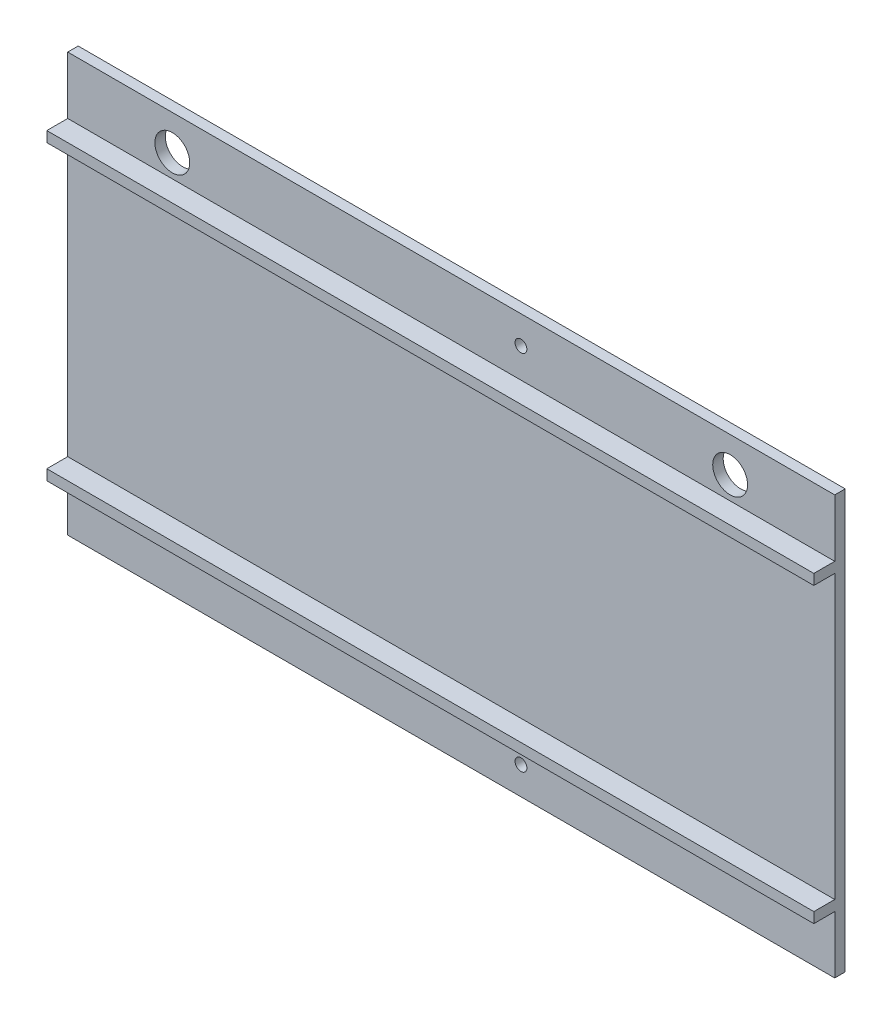
ISO-10303-21;
HEADER;
FILE_DESCRIPTION(('STEP AP214'),'2;1');
FILE_NAME('part.step','',(''),(''),'','','');
FILE_SCHEMA(('AUTOMOTIVE_DESIGN { 1 0 10303 214 1 1 1 1 }'));
ENDSEC;
DATA;
#1=APPLICATION_CONTEXT('core data for automotive mechanical design processes');
#2=APPLICATION_PROTOCOL_DEFINITION('international standard','automotive_design',2000,#1);
#3=PRODUCT_CONTEXT('',#1,'mechanical');
#4=PRODUCT('Part','Part','',(#3));
#5=PRODUCT_RELATED_PRODUCT_CATEGORY('part','',(#4));
#6=PRODUCT_DEFINITION_FORMATION('','',#4);
#7=PRODUCT_DEFINITION_CONTEXT('part definition',#1,'design');
#8=PRODUCT_DEFINITION('design','',#6,#7);
#9=PRODUCT_DEFINITION_SHAPE('','',#8);
#10=(LENGTH_UNIT() NAMED_UNIT(*) SI_UNIT(.MILLI.,.METRE.));
#11=(NAMED_UNIT(*) PLANE_ANGLE_UNIT() SI_UNIT($,.RADIAN.));
#12=(NAMED_UNIT(*) SI_UNIT($,.STERADIAN.) SOLID_ANGLE_UNIT());
#13=UNCERTAINTY_MEASURE_WITH_UNIT(LENGTH_MEASURE(1.E-05),#10,'distance_accuracy_value','');
#14=(GEOMETRIC_REPRESENTATION_CONTEXT(3) GLOBAL_UNCERTAINTY_ASSIGNED_CONTEXT((#13)) GLOBAL_UNIT_ASSIGNED_CONTEXT((#10,
#11,#12)) REPRESENTATION_CONTEXT('',''));
#15=CARTESIAN_POINT('',(0.,0.,0.));
#16=DIRECTION('',(0.,0.,1.));
#17=DIRECTION('',(1.,0.,0.));
#18=AXIS2_PLACEMENT_3D('',#15,#16,#17);
#19=CARTESIAN_POINT('',(0.,0.,43.));
#20=DIRECTION('',(0.,0.,-1.));
#21=DIRECTION('',(-1.,0.,0.));
#22=AXIS2_PLACEMENT_3D('',#19,#20,#21);
#23=PLANE('',#22);
#24=DIRECTION('',(1.,0.,0.));
#25=VECTOR('',#24,1.);
#26=CARTESIAN_POINT('',(0.,40.5,43.));
#27=LINE('',#26,#25);
#28=CARTESIAN_POINT('',(-110.,40.5,43.));
#29=VERTEX_POINT('',#28);
#30=CARTESIAN_POINT('',(110.,40.5,43.));
#31=VERTEX_POINT('',#30);
#32=EDGE_CURVE('E57',#29,#31,#27,.T.);
#33=ORIENTED_EDGE('',*,*,#32,.F.);
#34=DIRECTION('',(0.,-1.,0.));
#35=VECTOR('',#34,1.);
#36=CARTESIAN_POINT('',(-110.,-60.,43.));
#37=LINE('',#36,#35);
#38=CARTESIAN_POINT('',(-110.,-40.5,43.));
#39=VERTEX_POINT('',#38);
#40=EDGE_CURVE('E155',#29,#39,#37,.T.);
#41=ORIENTED_EDGE('',*,*,#40,.T.);
#42=DIRECTION('',(-1.,0.,0.));
#43=VECTOR('',#42,1.);
#44=CARTESIAN_POINT('',(0.,-40.5,43.));
#45=LINE('',#44,#43);
#46=CARTESIAN_POINT('',(110.,-40.5,43.));
#47=VERTEX_POINT('',#46);
#48=EDGE_CURVE('E48',#47,#39,#45,.T.);
#49=ORIENTED_EDGE('',*,*,#48,.F.);
#50=DIRECTION('',(0.,1.,0.));
#51=VECTOR('',#50,1.);
#52=CARTESIAN_POINT('',(110.,-60.,43.));
#53=LINE('',#52,#51);
#54=EDGE_CURVE('E190',#47,#31,#53,.T.);
#55=ORIENTED_EDGE('',*,*,#54,.T.);
#56=EDGE_LOOP('',(#33,#41,#49,#55));
#57=FACE_BOUND('',#56,.T.);
#58=ADVANCED_FACE('F39',(#57),#23,.F.);
#59=CARTESIAN_POINT('',(20.,52.,43.));
#60=DIRECTION('',(0.,0.,-1.));
#61=DIRECTION('',(-1.,0.,0.));
#62=AXIS2_PLACEMENT_3D('',#59,#60,#61);
#63=CIRCLE('',#62,1.7);
#64=CARTESIAN_POINT('',(18.3,52.,43.));
#65=VERTEX_POINT('',#64);
#66=EDGE_CURVE('E225',#65,#65,#63,.F.);
#67=ORIENTED_EDGE('',*,*,#66,.F.);
#68=EDGE_LOOP('',(#67));
#69=FACE_BOUND('',#68,.T.);
#70=CARTESIAN_POINT('',(80.,50.,43.));
#71=DIRECTION('',(0.,0.,-1.));
#72=DIRECTION('',(-1.,0.,0.));
#73=AXIS2_PLACEMENT_3D('',#70,#71,#72);
#74=CIRCLE('',#73,5.00000000000001);
#75=CARTESIAN_POINT('',(75.,50.,43.));
#76=VERTEX_POINT('',#75);
#77=EDGE_CURVE('E216',#76,#76,#74,.F.);
#78=ORIENTED_EDGE('',*,*,#77,.F.);
#79=EDGE_LOOP('',(#78));
#80=FACE_BOUND('',#79,.T.);
#81=CARTESIAN_POINT('',(-80.,50.,43.));
#82=DIRECTION('',(0.,0.,-1.));
#83=DIRECTION('',(-1.,0.,0.));
#84=AXIS2_PLACEMENT_3D('',#81,#82,#83);
#85=CIRCLE('',#84,5.00000000000001);
#86=CARTESIAN_POINT('',(-85.,50.,43.));
#87=VERTEX_POINT('',#86);
#88=EDGE_CURVE('E149',#87,#87,#85,.F.);
#89=ORIENTED_EDGE('',*,*,#88,.F.);
#90=EDGE_LOOP('',(#89));
#91=FACE_BOUND('',#90,.T.);
#92=DIRECTION('',(-1.,0.,0.));
#93=VECTOR('',#92,1.);
#94=CARTESIAN_POINT('',(0.,43.5,43.));
#95=LINE('',#94,#93);
#96=CARTESIAN_POINT('',(110.,43.5,43.));
#97=VERTEX_POINT('',#96);
#98=CARTESIAN_POINT('',(-110.,43.5,43.));
#99=VERTEX_POINT('',#98);
#100=EDGE_CURVE('E63',#97,#99,#95,.T.);
#101=ORIENTED_EDGE('',*,*,#100,.F.);
#102=CARTESIAN_POINT('',(110.,60.,43.));
#103=VERTEX_POINT('',#102);
#104=EDGE_CURVE('E186',#97,#103,#53,.T.);
#105=ORIENTED_EDGE('',*,*,#104,.T.);
#106=DIRECTION('',(-1.,0.,0.));
#107=VECTOR('',#106,1.);
#108=CARTESIAN_POINT('',(-110.,60.,43.));
#109=LINE('',#108,#107);
#110=CARTESIAN_POINT('',(-110.,60.,43.));
#111=VERTEX_POINT('',#110);
#112=EDGE_CURVE('E188',#103,#111,#109,.T.);
#113=ORIENTED_EDGE('',*,*,#112,.T.);
#114=EDGE_CURVE('E182',#111,#99,#37,.T.);
#115=ORIENTED_EDGE('',*,*,#114,.T.);
#116=EDGE_LOOP('',(#101,#105,#113,#115));
#117=FACE_BOUND('',#116,.T.);
#118=ADVANCED_FACE('F281',(#69,#80,#91,#117),#23,.F.);
#119=CARTESIAN_POINT('',(20.,-52.,43.));
#120=DIRECTION('',(0.,0.,-1.));
#121=DIRECTION('',(-1.,0.,0.));
#122=AXIS2_PLACEMENT_3D('',#119,#120,#121);
#123=CIRCLE('',#122,1.7);
#124=CARTESIAN_POINT('',(18.3,-52.,43.));
#125=VERTEX_POINT('',#124);
#126=EDGE_CURVE('E218',#125,#125,#123,.F.);
#127=ORIENTED_EDGE('',*,*,#126,.F.);
#128=EDGE_LOOP('',(#127));
#129=FACE_BOUND('',#128,.T.);
#130=DIRECTION('',(1.,0.,0.));
#131=VECTOR('',#130,1.);
#132=CARTESIAN_POINT('',(0.,-43.5,43.));
#133=LINE('',#132,#131);
#134=CARTESIAN_POINT('',(-110.,-43.5,43.));
#135=VERTEX_POINT('',#134);
#136=CARTESIAN_POINT('',(110.,-43.5,43.));
#137=VERTEX_POINT('',#136);
#138=EDGE_CURVE('E11',#135,#137,#133,.T.);
#139=ORIENTED_EDGE('',*,*,#138,.F.);
#140=CARTESIAN_POINT('',(-110.,-60.,43.));
#141=VERTEX_POINT('',#140);
#142=EDGE_CURVE('E184',#135,#141,#37,.T.);
#143=ORIENTED_EDGE('',*,*,#142,.T.);
#144=DIRECTION('',(1.,0.,0.));
#145=VECTOR('',#144,1.);
#146=CARTESIAN_POINT('',(-110.,-60.,43.));
#147=LINE('',#146,#145);
#148=CARTESIAN_POINT('',(110.,-60.,43.));
#149=VERTEX_POINT('',#148);
#150=EDGE_CURVE('E181',#141,#149,#147,.T.);
#151=ORIENTED_EDGE('',*,*,#150,.T.);
#152=EDGE_CURVE('E187',#149,#137,#53,.T.);
#153=ORIENTED_EDGE('',*,*,#152,.T.);
#154=EDGE_LOOP('',(#139,#143,#151,#153));
#155=FACE_BOUND('',#154,.T.);
#156=ADVANCED_FACE('F264',(#129,#155),#23,.F.);
#157=CARTESIAN_POINT('',(-110.,-60.,43.));
#158=DIRECTION('',(1.,0.,0.));
#159=DIRECTION('',(0.,0.,-1.));
#160=AXIS2_PLACEMENT_3D('',#157,#158,#159);
#161=PLANE('',#160);
#162=ORIENTED_EDGE('',*,*,#40,.F.);
#163=DIRECTION('',(0.,0.,-1.));
#164=VECTOR('',#163,1.);
#165=CARTESIAN_POINT('',(-110.,40.5,49.));
#166=LINE('',#165,#164);
#167=CARTESIAN_POINT('',(-110.,40.5,49.));
#168=VERTEX_POINT('',#167);
#169=EDGE_CURVE('E133',#168,#29,#166,.T.);
#170=ORIENTED_EDGE('',*,*,#169,.F.);
#171=DIRECTION('',(0.,-1.,0.));
#172=VECTOR('',#171,1.);
#173=CARTESIAN_POINT('',(-110.,40.5,49.));
#174=LINE('',#173,#172);
#175=CARTESIAN_POINT('',(-110.,43.5,49.));
#176=VERTEX_POINT('',#175);
#177=EDGE_CURVE('E140',#176,#168,#174,.T.);
#178=ORIENTED_EDGE('',*,*,#177,.F.);
#179=DIRECTION('',(0.,0.,-1.));
#180=VECTOR('',#179,1.);
#181=CARTESIAN_POINT('',(-110.,43.5,49.));
#182=LINE('',#181,#180);
#183=EDGE_CURVE('E239',#176,#99,#182,.T.);
#184=ORIENTED_EDGE('',*,*,#183,.T.);
#185=ORIENTED_EDGE('',*,*,#114,.F.);
#186=DIRECTION('',(0.,0.,-1.));
#187=VECTOR('',#186,1.);
#188=CARTESIAN_POINT('',(-110.,60.,43.));
#189=LINE('',#188,#187);
#190=CARTESIAN_POINT('',(-110.,60.,40.));
#191=VERTEX_POINT('',#190);
#192=EDGE_CURVE('E192',#111,#191,#189,.T.);
#193=ORIENTED_EDGE('',*,*,#192,.T.);
#194=DIRECTION('',(0.,-1.,0.));
#195=VECTOR('',#194,1.);
#196=CARTESIAN_POINT('',(-110.,-60.,40.));
#197=LINE('',#196,#195);
#198=CARTESIAN_POINT('',(-110.,-60.,40.));
#199=VERTEX_POINT('',#198);
#200=EDGE_CURVE('E180',#191,#199,#197,.T.);
#201=ORIENTED_EDGE('',*,*,#200,.T.);
#202=DIRECTION('',(0.,0.,-1.));
#203=VECTOR('',#202,1.);
#204=CARTESIAN_POINT('',(-110.,-60.,43.));
#205=LINE('',#204,#203);
#206=EDGE_CURVE('E208',#141,#199,#205,.T.);
#207=ORIENTED_EDGE('',*,*,#206,.F.);
#208=ORIENTED_EDGE('',*,*,#142,.F.);
#209=DIRECTION('',(0.,0.,-1.));
#210=VECTOR('',#209,1.);
#211=CARTESIAN_POINT('',(-110.,-43.5,49.));
#212=LINE('',#211,#210);
#213=CARTESIAN_POINT('',(-110.,-43.5,49.));
#214=VERTEX_POINT('',#213);
#215=EDGE_CURVE('E177',#214,#135,#212,.T.);
#216=ORIENTED_EDGE('',*,*,#215,.F.);
#217=DIRECTION('',(0.,-1.,0.));
#218=VECTOR('',#217,1.);
#219=CARTESIAN_POINT('',(-110.,-43.5,49.));
#220=LINE('',#219,#218);
#221=CARTESIAN_POINT('',(-110.,-40.5,49.));
#222=VERTEX_POINT('',#221);
#223=EDGE_CURVE('E159',#222,#214,#220,.T.);
#224=ORIENTED_EDGE('',*,*,#223,.F.);
#225=DIRECTION('',(0.,0.,-1.));
#226=VECTOR('',#225,1.);
#227=CARTESIAN_POINT('',(-110.,-40.5,49.));
#228=LINE('',#227,#226);
#229=EDGE_CURVE('E166',#222,#39,#228,.T.);
#230=ORIENTED_EDGE('',*,*,#229,.T.);
#231=EDGE_LOOP('',(#162,#170,#178,#184,#185,#193,#201,#207,#208,#216,#224,#230));
#232=FACE_BOUND('',#231,.T.);
#233=ADVANCED_FACE('F41',(#232),#161,.F.);
#234=CARTESIAN_POINT('',(-110.,-60.,43.));
#235=DIRECTION('',(0.,1.,0.));
#236=DIRECTION('',(0.,0.,1.));
#237=AXIS2_PLACEMENT_3D('',#234,#235,#236);
#238=PLANE('',#237);
#239=DIRECTION('',(1.,0.,0.));
#240=VECTOR('',#239,1.);
#241=CARTESIAN_POINT('',(-110.,-60.,40.));
#242=LINE('',#241,#240);
#243=CARTESIAN_POINT('',(110.,-60.,40.));
#244=VERTEX_POINT('',#243);
#245=EDGE_CURVE('E193',#199,#244,#242,.T.);
#246=ORIENTED_EDGE('',*,*,#245,.T.);
#247=DIRECTION('',(0.,0.,-1.));
#248=VECTOR('',#247,1.);
#249=CARTESIAN_POINT('',(110.,-60.,43.));
#250=LINE('',#249,#248);
#251=EDGE_CURVE('E202',#149,#244,#250,.T.);
#252=ORIENTED_EDGE('',*,*,#251,.F.);
#253=ORIENTED_EDGE('',*,*,#150,.F.);
#254=ORIENTED_EDGE('',*,*,#206,.T.);
#255=EDGE_LOOP('',(#246,#252,#253,#254));
#256=FACE_BOUND('',#255,.T.);
#257=ADVANCED_FACE('F271',(#256),#238,.F.);
#258=CARTESIAN_POINT('',(110.,-60.,43.));
#259=DIRECTION('',(-1.,0.,0.));
#260=DIRECTION('',(0.,0.,1.));
#261=AXIS2_PLACEMENT_3D('',#258,#259,#260);
#262=PLANE('',#261);
#263=ORIENTED_EDGE('',*,*,#104,.F.);
#264=DIRECTION('',(0.,0.,-1.));
#265=VECTOR('',#264,1.);
#266=CARTESIAN_POINT('',(110.,43.5,49.));
#267=LINE('',#266,#265);
#268=CARTESIAN_POINT('',(110.,43.5,49.));
#269=VERTEX_POINT('',#268);
#270=EDGE_CURVE('E154',#269,#97,#267,.T.);
#271=ORIENTED_EDGE('',*,*,#270,.F.);
#272=DIRECTION('',(0.,1.,0.));
#273=VECTOR('',#272,1.);
#274=CARTESIAN_POINT('',(110.,40.5,49.));
#275=LINE('',#274,#273);
#276=CARTESIAN_POINT('',(110.,40.5,49.));
#277=VERTEX_POINT('',#276);
#278=EDGE_CURVE('E138',#277,#269,#275,.T.);
#279=ORIENTED_EDGE('',*,*,#278,.F.);
#280=DIRECTION('',(0.,0.,-1.));
#281=VECTOR('',#280,1.);
#282=CARTESIAN_POINT('',(110.,40.5,49.));
#283=LINE('',#282,#281);
#284=EDGE_CURVE('E136',#277,#31,#283,.T.);
#285=ORIENTED_EDGE('',*,*,#284,.T.);
#286=ORIENTED_EDGE('',*,*,#54,.F.);
#287=DIRECTION('',(0.,0.,-1.));
#288=VECTOR('',#287,1.);
#289=CARTESIAN_POINT('',(110.,-40.5,49.));
#290=LINE('',#289,#288);
#291=CARTESIAN_POINT('',(110.,-40.5,49.));
#292=VERTEX_POINT('',#291);
#293=EDGE_CURVE('E171',#292,#47,#290,.T.);
#294=ORIENTED_EDGE('',*,*,#293,.F.);
#295=DIRECTION('',(0.,1.,0.));
#296=VECTOR('',#295,1.);
#297=CARTESIAN_POINT('',(110.,-43.5,49.));
#298=LINE('',#297,#296);
#299=CARTESIAN_POINT('',(110.,-43.5,49.));
#300=VERTEX_POINT('',#299);
#301=EDGE_CURVE('E164',#300,#292,#298,.T.);
#302=ORIENTED_EDGE('',*,*,#301,.F.);
#303=DIRECTION('',(0.,0.,-1.));
#304=VECTOR('',#303,1.);
#305=CARTESIAN_POINT('',(110.,-43.5,49.));
#306=LINE('',#305,#304);
#307=EDGE_CURVE('E173',#300,#137,#306,.T.);
#308=ORIENTED_EDGE('',*,*,#307,.T.);
#309=ORIENTED_EDGE('',*,*,#152,.F.);
#310=ORIENTED_EDGE('',*,*,#251,.T.);
#311=DIRECTION('',(0.,1.,0.));
#312=VECTOR('',#311,1.);
#313=CARTESIAN_POINT('',(110.,-60.,40.));
#314=LINE('',#313,#312);
#315=CARTESIAN_POINT('',(110.,60.,40.));
#316=VERTEX_POINT('',#315);
#317=EDGE_CURVE('E198',#244,#316,#314,.T.);
#318=ORIENTED_EDGE('',*,*,#317,.T.);
#319=DIRECTION('',(0.,0.,-1.));
#320=VECTOR('',#319,1.);
#321=CARTESIAN_POINT('',(110.,60.,43.));
#322=LINE('',#321,#320);
#323=EDGE_CURVE('E205',#103,#316,#322,.T.);
#324=ORIENTED_EDGE('',*,*,#323,.F.);
#325=EDGE_LOOP('',(#263,#271,#279,#285,#286,#294,#302,#308,#309,#310,#318,#324));
#326=FACE_BOUND('',#325,.T.);
#327=ADVANCED_FACE('F245',(#326),#262,.F.);
#328=CARTESIAN_POINT('',(-110.,60.,43.));
#329=DIRECTION('',(0.,-1.,0.));
#330=DIRECTION('',(0.,0.,-1.));
#331=AXIS2_PLACEMENT_3D('',#328,#329,#330);
#332=PLANE('',#331);
#333=DIRECTION('',(-1.,0.,0.));
#334=VECTOR('',#333,1.);
#335=CARTESIAN_POINT('',(-110.,60.,40.));
#336=LINE('',#335,#334);
#337=EDGE_CURVE('E196',#316,#191,#336,.T.);
#338=ORIENTED_EDGE('',*,*,#337,.T.);
#339=ORIENTED_EDGE('',*,*,#192,.F.);
#340=ORIENTED_EDGE('',*,*,#112,.F.);
#341=ORIENTED_EDGE('',*,*,#323,.T.);
#342=EDGE_LOOP('',(#338,#339,#340,#341));
#343=FACE_BOUND('',#342,.T.);
#344=ADVANCED_FACE('F276',(#343),#332,.F.);
#345=CARTESIAN_POINT('',(0.,0.,40.));
#346=DIRECTION('',(0.,0.,-1.));
#347=DIRECTION('',(-1.,0.,0.));
#348=AXIS2_PLACEMENT_3D('',#345,#346,#347);
#349=PLANE('',#348);
#350=CARTESIAN_POINT('',(20.,52.,40.));
#351=DIRECTION('',(0.,0.,-1.));
#352=DIRECTION('',(-1.,0.,0.));
#353=AXIS2_PLACEMENT_3D('',#350,#351,#352);
#354=CIRCLE('',#353,1.7);
#355=CARTESIAN_POINT('',(18.3,52.,40.));
#356=VERTEX_POINT('',#355);
#357=EDGE_CURVE('E43',#356,#356,#354,.F.);
#358=ORIENTED_EDGE('',*,*,#357,.T.);
#359=EDGE_LOOP('',(#358));
#360=FACE_BOUND('',#359,.T.);
#361=CARTESIAN_POINT('',(20.,-52.,40.));
#362=DIRECTION('',(0.,0.,-1.));
#363=DIRECTION('',(-1.,0.,0.));
#364=AXIS2_PLACEMENT_3D('',#361,#362,#363);
#365=CIRCLE('',#364,1.7);
#366=CARTESIAN_POINT('',(18.3,-52.,40.));
#367=VERTEX_POINT('',#366);
#368=EDGE_CURVE('E219',#367,#367,#365,.F.);
#369=ORIENTED_EDGE('',*,*,#368,.T.);
#370=EDGE_LOOP('',(#369));
#371=FACE_BOUND('',#370,.T.);
#372=CARTESIAN_POINT('',(80.,50.,40.));
#373=DIRECTION('',(0.,0.,-1.));
#374=DIRECTION('',(-1.,0.,0.));
#375=AXIS2_PLACEMENT_3D('',#372,#373,#374);
#376=CIRCLE('',#375,5.00000000000001);
#377=CARTESIAN_POINT('',(75.,50.,40.));
#378=VERTEX_POINT('',#377);
#379=EDGE_CURVE('E220',#378,#378,#376,.F.);
#380=ORIENTED_EDGE('',*,*,#379,.T.);
#381=EDGE_LOOP('',(#380));
#382=FACE_BOUND('',#381,.T.);
#383=CARTESIAN_POINT('',(-80.,50.,40.));
#384=DIRECTION('',(0.,0.,-1.));
#385=DIRECTION('',(-1.,0.,0.));
#386=AXIS2_PLACEMENT_3D('',#383,#384,#385);
#387=CIRCLE('',#386,5.00000000000001);
#388=CARTESIAN_POINT('',(-85.,50.,40.));
#389=VERTEX_POINT('',#388);
#390=EDGE_CURVE('E213',#389,#389,#387,.F.);
#391=ORIENTED_EDGE('',*,*,#390,.T.);
#392=EDGE_LOOP('',(#391));
#393=FACE_BOUND('',#392,.T.);
#394=ORIENTED_EDGE('',*,*,#245,.F.);
#395=ORIENTED_EDGE('',*,*,#200,.F.);
#396=ORIENTED_EDGE('',*,*,#337,.F.);
#397=ORIENTED_EDGE('',*,*,#317,.F.);
#398=EDGE_LOOP('',(#394,#395,#396,#397));
#399=FACE_BOUND('',#398,.T.);
#400=ADVANCED_FACE('F277',(#360,#371,#382,#393,#399),#349,.T.);
#401=CARTESIAN_POINT('',(-110.,-43.5,49.));
#402=DIRECTION('',(0.,1.,0.));
#403=DIRECTION('',(0.,0.,1.));
#404=AXIS2_PLACEMENT_3D('',#401,#402,#403);
#405=PLANE('',#404);
#406=ORIENTED_EDGE('',*,*,#215,.T.);
#407=ORIENTED_EDGE('',*,*,#138,.T.);
#408=ORIENTED_EDGE('',*,*,#307,.F.);
#409=DIRECTION('',(1.,0.,0.));
#410=VECTOR('',#409,1.);
#411=CARTESIAN_POINT('',(-110.,-43.5,49.));
#412=LINE('',#411,#410);
#413=EDGE_CURVE('E162',#214,#300,#412,.T.);
#414=ORIENTED_EDGE('',*,*,#413,.F.);
#415=EDGE_LOOP('',(#406,#407,#408,#414));
#416=FACE_BOUND('',#415,.T.);
#417=ADVANCED_FACE('F265',(#416),#405,.F.);
#418=CARTESIAN_POINT('',(-110.,-40.5,49.));
#419=DIRECTION('',(0.,-1.,0.));
#420=DIRECTION('',(0.,0.,-1.));
#421=AXIS2_PLACEMENT_3D('',#418,#419,#420);
#422=PLANE('',#421);
#423=ORIENTED_EDGE('',*,*,#293,.T.);
#424=ORIENTED_EDGE('',*,*,#48,.T.);
#425=ORIENTED_EDGE('',*,*,#229,.F.);
#426=DIRECTION('',(-1.,0.,0.));
#427=VECTOR('',#426,1.);
#428=CARTESIAN_POINT('',(-110.,-40.5,49.));
#429=LINE('',#428,#427);
#430=EDGE_CURVE('E170',#292,#222,#429,.T.);
#431=ORIENTED_EDGE('',*,*,#430,.F.);
#432=EDGE_LOOP('',(#423,#424,#425,#431));
#433=FACE_BOUND('',#432,.T.);
#434=ADVANCED_FACE('F251',(#433),#422,.F.);
#435=CARTESIAN_POINT('',(0.,0.,49.));
#436=DIRECTION('',(0.,0.,-1.));
#437=DIRECTION('',(-1.,0.,0.));
#438=AXIS2_PLACEMENT_3D('',#435,#436,#437);
#439=PLANE('',#438);
#440=ORIENTED_EDGE('',*,*,#223,.T.);
#441=ORIENTED_EDGE('',*,*,#413,.T.);
#442=ORIENTED_EDGE('',*,*,#301,.T.);
#443=ORIENTED_EDGE('',*,*,#430,.T.);
#444=EDGE_LOOP('',(#440,#441,#442,#443));
#445=FACE_BOUND('',#444,.T.);
#446=ADVANCED_FACE('F260',(#445),#439,.F.);
#447=CARTESIAN_POINT('',(-110.,40.5,49.));
#448=DIRECTION('',(0.,1.,0.));
#449=DIRECTION('',(0.,0.,1.));
#450=AXIS2_PLACEMENT_3D('',#447,#448,#449);
#451=PLANE('',#450);
#452=ORIENTED_EDGE('',*,*,#169,.T.);
#453=ORIENTED_EDGE('',*,*,#32,.T.);
#454=ORIENTED_EDGE('',*,*,#284,.F.);
#455=DIRECTION('',(1.,0.,0.));
#456=VECTOR('',#455,1.);
#457=CARTESIAN_POINT('',(-110.,40.5,49.));
#458=LINE('',#457,#456);
#459=EDGE_CURVE('E128',#168,#277,#458,.T.);
#460=ORIENTED_EDGE('',*,*,#459,.F.);
#461=EDGE_LOOP('',(#452,#453,#454,#460));
#462=FACE_BOUND('',#461,.T.);
#463=ADVANCED_FACE('F132',(#462),#451,.F.);
#464=CARTESIAN_POINT('',(-110.,43.5,49.));
#465=DIRECTION('',(0.,-1.,0.));
#466=DIRECTION('',(0.,0.,-1.));
#467=AXIS2_PLACEMENT_3D('',#464,#465,#466);
#468=PLANE('',#467);
#469=ORIENTED_EDGE('',*,*,#270,.T.);
#470=ORIENTED_EDGE('',*,*,#100,.T.);
#471=ORIENTED_EDGE('',*,*,#183,.F.);
#472=DIRECTION('',(-1.,0.,0.));
#473=VECTOR('',#472,1.);
#474=CARTESIAN_POINT('',(-110.,43.5,49.));
#475=LINE('',#474,#473);
#476=EDGE_CURVE('E144',#269,#176,#475,.T.);
#477=ORIENTED_EDGE('',*,*,#476,.F.);
#478=EDGE_LOOP('',(#469,#470,#471,#477));
#479=FACE_BOUND('',#478,.T.);
#480=ADVANCED_FACE('F244',(#479),#468,.F.);
#481=CARTESIAN_POINT('',(0.,0.,49.));
#482=DIRECTION('',(0.,0.,-1.));
#483=DIRECTION('',(-1.,0.,0.));
#484=AXIS2_PLACEMENT_3D('',#481,#482,#483);
#485=PLANE('',#484);
#486=ORIENTED_EDGE('',*,*,#177,.T.);
#487=ORIENTED_EDGE('',*,*,#459,.T.);
#488=ORIENTED_EDGE('',*,*,#278,.T.);
#489=ORIENTED_EDGE('',*,*,#476,.T.);
#490=EDGE_LOOP('',(#486,#487,#488,#489));
#491=FACE_BOUND('',#490,.T.);
#492=ADVANCED_FACE('F141',(#491),#485,.F.);
#493=CARTESIAN_POINT('',(-80.,50.,44.));
#494=DIRECTION('',(0.,0.,-1.));
#495=DIRECTION('',(-1.,0.,0.));
#496=AXIS2_PLACEMENT_3D('',#493,#494,#495);
#497=CYLINDRICAL_SURFACE('',#496,5.00000000000001);
#498=ORIENTED_EDGE('',*,*,#390,.F.);
#499=EDGE_LOOP('',(#498));
#500=FACE_BOUND('',#499,.T.);
#501=ORIENTED_EDGE('',*,*,#88,.T.);
#502=EDGE_LOOP('',(#501));
#503=FACE_BOUND('',#502,.T.);
#504=ADVANCED_FACE('F336',(#500,#503),#497,.F.);
#505=CARTESIAN_POINT('',(80.,50.,44.));
#506=DIRECTION('',(0.,0.,-1.));
#507=DIRECTION('',(-1.,0.,0.));
#508=AXIS2_PLACEMENT_3D('',#505,#506,#507);
#509=CYLINDRICAL_SURFACE('',#508,5.00000000000001);
#510=ORIENTED_EDGE('',*,*,#379,.F.);
#511=EDGE_LOOP('',(#510));
#512=FACE_BOUND('',#511,.T.);
#513=ORIENTED_EDGE('',*,*,#77,.T.);
#514=EDGE_LOOP('',(#513));
#515=FACE_BOUND('',#514,.T.);
#516=ADVANCED_FACE('F343',(#512,#515),#509,.F.);
#517=CARTESIAN_POINT('',(20.,-52.,44.));
#518=DIRECTION('',(0.,0.,-1.));
#519=DIRECTION('',(-1.,0.,0.));
#520=AXIS2_PLACEMENT_3D('',#517,#518,#519);
#521=CYLINDRICAL_SURFACE('',#520,1.7);
#522=ORIENTED_EDGE('',*,*,#368,.F.);
#523=EDGE_LOOP('',(#522));
#524=FACE_BOUND('',#523,.T.);
#525=ORIENTED_EDGE('',*,*,#126,.T.);
#526=EDGE_LOOP('',(#525));
#527=FACE_BOUND('',#526,.T.);
#528=ADVANCED_FACE('F352',(#524,#527),#521,.F.);
#529=CARTESIAN_POINT('',(20.,52.,44.));
#530=DIRECTION('',(0.,0.,-1.));
#531=DIRECTION('',(-1.,0.,0.));
#532=AXIS2_PLACEMENT_3D('',#529,#530,#531);
#533=CYLINDRICAL_SURFACE('',#532,1.7);
#534=ORIENTED_EDGE('',*,*,#357,.F.);
#535=EDGE_LOOP('',(#534));
#536=FACE_BOUND('',#535,.T.);
#537=ORIENTED_EDGE('',*,*,#66,.T.);
#538=EDGE_LOOP('',(#537));
#539=FACE_BOUND('',#538,.T.);
#540=ADVANCED_FACE('F368',(#536,#539),#533,.F.);
#541=CLOSED_SHELL('',(#58,#118,#156,#233,#257,#327,#344,#400,#417,#434,#446,#463,#480,#492,#504,
#516,#528,#540));
#542=MANIFOLD_SOLID_BREP('B2',#541);
#543=ADVANCED_BREP_SHAPE_REPRESENTATION('',(#18,#542),#14);
#544=SHAPE_DEFINITION_REPRESENTATION(#9,#543);
ENDSEC;
END-ISO-10303-21;
